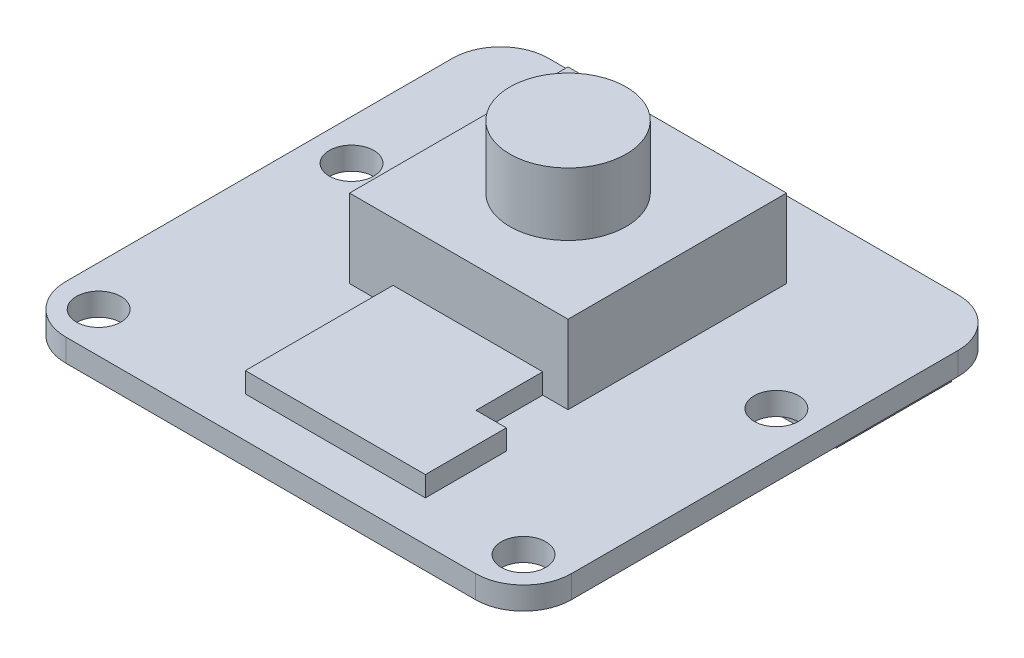
ISO-10303-21;
HEADER;
FILE_DESCRIPTION(('STEP AP214'),'2;1');
FILE_NAME('part.step','',(''),(''),'','','');
FILE_SCHEMA(('AUTOMOTIVE_DESIGN { 1 0 10303 214 1 1 1 1 }'));
ENDSEC;
DATA;
#1=APPLICATION_CONTEXT('core data for automotive mechanical design processes');
#2=APPLICATION_PROTOCOL_DEFINITION('international standard','automotive_design',2000,#1);
#3=PRODUCT_CONTEXT('',#1,'mechanical');
#4=PRODUCT('Part','Part','',(#3));
#5=PRODUCT_RELATED_PRODUCT_CATEGORY('part','',(#4));
#6=PRODUCT_DEFINITION_FORMATION('','',#4);
#7=PRODUCT_DEFINITION_CONTEXT('part definition',#1,'design');
#8=PRODUCT_DEFINITION('design','',#6,#7);
#9=PRODUCT_DEFINITION_SHAPE('','',#8);
#10=(LENGTH_UNIT() NAMED_UNIT(*) SI_UNIT(.MILLI.,.METRE.));
#11=(NAMED_UNIT(*) PLANE_ANGLE_UNIT() SI_UNIT($,.RADIAN.));
#12=(NAMED_UNIT(*) SI_UNIT($,.STERADIAN.) SOLID_ANGLE_UNIT());
#13=UNCERTAINTY_MEASURE_WITH_UNIT(LENGTH_MEASURE(1.E-05),#10,'distance_accuracy_value','');
#14=(GEOMETRIC_REPRESENTATION_CONTEXT(3) GLOBAL_UNCERTAINTY_ASSIGNED_CONTEXT((#13)) GLOBAL_UNIT_ASSIGNED_CONTEXT((#10,
#11,#12)) REPRESENTATION_CONTEXT('',''));
#15=CARTESIAN_POINT('',(0.,0.,0.));
#16=DIRECTION('',(0.,0.,1.));
#17=DIRECTION('',(1.,0.,0.));
#18=AXIS2_PLACEMENT_3D('',#15,#16,#17);
#19=CARTESIAN_POINT('',(-10.125,1.12,9.556));
#20=DIRECTION('',(0.,1.,0.));
#21=DIRECTION('',(0.,0.,1.));
#22=AXIS2_PLACEMENT_3D('',#19,#20,#21);
#23=PLANE('',#22);
#24=CARTESIAN_POINT('',(-10.5,1.12,-2.569));
#25=DIRECTION('',(0.,1.,0.));
#26=DIRECTION('',(0.,0.,1.));
#27=AXIS2_PLACEMENT_3D('',#24,#25,#26);
#28=CIRCLE('',#27,1.1);
#29=CARTESIAN_POINT('',(-10.5,1.12,-1.469));
#30=VERTEX_POINT('',#29);
#31=EDGE_CURVE('E287',#30,#30,#28,.T.);
#32=ORIENTED_EDGE('',*,*,#31,.F.);
#33=EDGE_LOOP('',(#32));
#34=FACE_BOUND('',#33,.T.);
#35=CARTESIAN_POINT('',(10.5,1.12,9.931));
#36=DIRECTION('',(0.,1.,0.));
#37=DIRECTION('',(0.,0.,1.));
#38=AXIS2_PLACEMENT_3D('',#35,#36,#37);
#39=CIRCLE('',#38,1.1);
#40=CARTESIAN_POINT('',(10.5,1.12,11.031));
#41=VERTEX_POINT('',#40);
#42=EDGE_CURVE('E286',#41,#41,#39,.T.);
#43=ORIENTED_EDGE('',*,*,#42,.F.);
#44=EDGE_LOOP('',(#43));
#45=FACE_BOUND('',#44,.T.);
#46=CARTESIAN_POINT('',(10.5,1.12,-2.569));
#47=DIRECTION('',(0.,1.,0.));
#48=DIRECTION('',(0.,0.,1.));
#49=AXIS2_PLACEMENT_3D('',#46,#47,#48);
#50=CIRCLE('',#49,1.1);
#51=CARTESIAN_POINT('',(10.5,1.12,-1.469));
#52=VERTEX_POINT('',#51);
#53=EDGE_CURVE('E280',#52,#52,#50,.T.);
#54=ORIENTED_EDGE('',*,*,#53,.F.);
#55=EDGE_LOOP('',(#54));
#56=FACE_BOUND('',#55,.T.);
#57=CARTESIAN_POINT('',(-10.5,1.12,9.931));
#58=DIRECTION('',(0.,1.,0.));
#59=DIRECTION('',(0.,0.,1.));
#60=AXIS2_PLACEMENT_3D('',#57,#58,#59);
#61=CIRCLE('',#60,1.1);
#62=CARTESIAN_POINT('',(-10.5,1.12,11.031));
#63=VERTEX_POINT('',#62);
#64=EDGE_CURVE('E294',#63,#63,#61,.T.);
#65=ORIENTED_EDGE('',*,*,#64,.F.);
#66=EDGE_LOOP('',(#65));
#67=FACE_BOUND('',#66,.T.);
#68=CARTESIAN_POINT('',(-10.125,1.12,9.556));
#69=DIRECTION('',(0.,1.,0.));
#70=DIRECTION('',(0.,0.,1.));
#71=AXIS2_PLACEMENT_3D('',#68,#69,#70);
#72=CIRCLE('',#71,2.375);
#73=CARTESIAN_POINT('',(-12.5,1.12,9.55599999999998));
#74=VERTEX_POINT('',#73);
#75=CARTESIAN_POINT('',(-10.125,1.12,11.931));
#76=VERTEX_POINT('',#75);
#77=EDGE_CURVE('E305',#74,#76,#72,.T.);
#78=ORIENTED_EDGE('',*,*,#77,.T.);
#79=DIRECTION('',(1.,0.,0.));
#80=VECTOR('',#79,1.);
#81=CARTESIAN_POINT('',(-10.125,1.12,11.931));
#82=LINE('',#81,#80);
#83=CARTESIAN_POINT('',(10.125,1.12,11.931));
#84=VERTEX_POINT('',#83);
#85=EDGE_CURVE('E308',#76,#84,#82,.T.);
#86=ORIENTED_EDGE('',*,*,#85,.T.);
#87=CARTESIAN_POINT('',(10.125,1.12,9.556));
#88=DIRECTION('',(0.,1.,0.));
#89=DIRECTION('',(0.,0.,1.));
#90=AXIS2_PLACEMENT_3D('',#87,#88,#89);
#91=CIRCLE('',#90,2.375);
#92=CARTESIAN_POINT('',(12.5,1.12,9.55599999999998));
#93=VERTEX_POINT('',#92);
#94=EDGE_CURVE('E311',#84,#93,#91,.T.);
#95=ORIENTED_EDGE('',*,*,#94,.T.);
#96=DIRECTION('',(0.,0.,-1.));
#97=VECTOR('',#96,1.);
#98=CARTESIAN_POINT('',(12.5,1.12,-9.55599999999998));
#99=LINE('',#98,#97);
#100=CARTESIAN_POINT('',(12.5,1.12,-9.55599999999998));
#101=VERTEX_POINT('',#100);
#102=EDGE_CURVE('E313',#93,#101,#99,.T.);
#103=ORIENTED_EDGE('',*,*,#102,.T.);
#104=CARTESIAN_POINT('',(10.125,1.12,-9.556));
#105=DIRECTION('',(0.,1.,0.));
#106=DIRECTION('',(0.,0.,-1.));
#107=AXIS2_PLACEMENT_3D('',#104,#105,#106);
#108=CIRCLE('',#107,2.375);
#109=CARTESIAN_POINT('',(10.125,1.12,-11.931));
#110=VERTEX_POINT('',#109);
#111=EDGE_CURVE('E315',#101,#110,#108,.T.);
#112=ORIENTED_EDGE('',*,*,#111,.T.);
#113=DIRECTION('',(-1.,0.,0.));
#114=VECTOR('',#113,1.);
#115=CARTESIAN_POINT('',(-10.125,1.12,-11.931));
#116=LINE('',#115,#114);
#117=CARTESIAN_POINT('',(-10.125,1.12,-11.931));
#118=VERTEX_POINT('',#117);
#119=EDGE_CURVE('E317',#110,#118,#116,.T.);
#120=ORIENTED_EDGE('',*,*,#119,.T.);
#121=CARTESIAN_POINT('',(-10.125,1.12,-9.556));
#122=DIRECTION('',(0.,1.,0.));
#123=DIRECTION('',(0.,0.,1.));
#124=AXIS2_PLACEMENT_3D('',#121,#122,#123);
#125=CIRCLE('',#124,2.375);
#126=CARTESIAN_POINT('',(-12.5,1.12,-9.55599999999998));
#127=VERTEX_POINT('',#126);
#128=EDGE_CURVE('E319',#118,#127,#125,.T.);
#129=ORIENTED_EDGE('',*,*,#128,.T.);
#130=DIRECTION('',(0.,0.,1.));
#131=VECTOR('',#130,1.);
#132=CARTESIAN_POINT('',(-12.5,1.12,-9.55599999999998));
#133=LINE('',#132,#131);
#134=EDGE_CURVE('E321',#127,#74,#133,.T.);
#135=ORIENTED_EDGE('',*,*,#134,.T.);
#136=EDGE_LOOP('',(#78,#86,#95,#103,#112,#120,#129,#135));
#137=FACE_BOUND('',#136,.T.);
#138=DIRECTION('',(1.,0.,0.));
#139=VECTOR('',#138,1.);
#140=CARTESIAN_POINT('',(-5.4,1.12,2.631));
#141=LINE('',#140,#139);
#142=CARTESIAN_POINT('',(4.15,1.12,2.631));
#143=VERTEX_POINT('',#142);
#144=CARTESIAN_POINT('',(5.4,1.12,2.631));
#145=VERTEX_POINT('',#144);
#146=EDGE_CURVE('E268',#143,#145,#141,.T.);
#147=ORIENTED_EDGE('',*,*,#146,.F.);
#148=DIRECTION('',(0.,0.,-1.));
#149=VECTOR('',#148,1.);
#150=CARTESIAN_POINT('',(4.15,1.12,5.931));
#151=LINE('',#150,#149);
#152=CARTESIAN_POINT('',(4.15,1.12,5.931));
#153=VERTEX_POINT('',#152);
#154=EDGE_CURVE('E530',#153,#143,#151,.T.);
#155=ORIENTED_EDGE('',*,*,#154,.F.);
#156=DIRECTION('',(-1.,0.,0.));
#157=VECTOR('',#156,1.);
#158=CARTESIAN_POINT('',(4.15,1.12,5.931));
#159=LINE('',#158,#157);
#160=CARTESIAN_POINT('',(5.65,1.12,5.931));
#161=VERTEX_POINT('',#160);
#162=EDGE_CURVE('E537',#161,#153,#159,.T.);
#163=ORIENTED_EDGE('',*,*,#162,.F.);
#164=DIRECTION('',(0.,0.,-1.));
#165=VECTOR('',#164,1.);
#166=CARTESIAN_POINT('',(5.65,1.12,9.931));
#167=LINE('',#166,#165);
#168=CARTESIAN_POINT('',(5.65,1.12,9.931));
#169=VERTEX_POINT('',#168);
#170=EDGE_CURVE('E535',#169,#161,#167,.T.);
#171=ORIENTED_EDGE('',*,*,#170,.F.);
#172=DIRECTION('',(1.,0.,0.));
#173=VECTOR('',#172,1.);
#174=CARTESIAN_POINT('',(-3.25,1.12,9.931));
#175=LINE('',#174,#173);
#176=CARTESIAN_POINT('',(-3.25,1.12,9.931));
#177=VERTEX_POINT('',#176);
#178=EDGE_CURVE('E212',#177,#169,#175,.T.);
#179=ORIENTED_EDGE('',*,*,#178,.F.);
#180=DIRECTION('',(0.,0.,1.));
#181=VECTOR('',#180,1.);
#182=CARTESIAN_POINT('',(-3.25,1.12,9.931));
#183=LINE('',#182,#181);
#184=CARTESIAN_POINT('',(-3.25,1.12,2.631));
#185=VERTEX_POINT('',#184);
#186=EDGE_CURVE('E208',#185,#177,#183,.T.);
#187=ORIENTED_EDGE('',*,*,#186,.F.);
#188=CARTESIAN_POINT('',(-5.4,1.12,2.631));
#189=VERTEX_POINT('',#188);
#190=EDGE_CURVE('E253',#189,#185,#141,.T.);
#191=ORIENTED_EDGE('',*,*,#190,.F.);
#192=DIRECTION('',(0.,0.,1.));
#193=VECTOR('',#192,1.);
#194=CARTESIAN_POINT('',(-5.4,1.12,-8.169));
#195=LINE('',#194,#193);
#196=CARTESIAN_POINT('',(-5.4,1.12,-8.169));
#197=VERTEX_POINT('',#196);
#198=EDGE_CURVE('E265',#197,#189,#195,.T.);
#199=ORIENTED_EDGE('',*,*,#198,.F.);
#200=DIRECTION('',(-1.,0.,0.));
#201=VECTOR('',#200,1.);
#202=CARTESIAN_POINT('',(-5.4,1.12,-8.169));
#203=LINE('',#202,#201);
#204=CARTESIAN_POINT('',(5.4,1.12,-8.169));
#205=VERTEX_POINT('',#204);
#206=EDGE_CURVE('E263',#205,#197,#203,.T.);
#207=ORIENTED_EDGE('',*,*,#206,.F.);
#208=DIRECTION('',(0.,0.,-1.));
#209=VECTOR('',#208,1.);
#210=CARTESIAN_POINT('',(5.4,1.12,-8.169));
#211=LINE('',#210,#209);
#212=EDGE_CURVE('E260',#145,#205,#211,.T.);
#213=ORIENTED_EDGE('',*,*,#212,.F.);
#214=EDGE_LOOP('',(#147,#155,#163,#171,#179,#187,#191,#199,#207,#213));
#215=FACE_BOUND('',#214,.T.);
#216=ADVANCED_FACE('F38',(#34,#45,#56,#67,#137,#215),#23,.T.);
#217=CARTESIAN_POINT('',(-5.4,4.995,2.631));
#218=DIRECTION('',(0.,0.,-1.));
#219=DIRECTION('',(-1.,0.,0.));
#220=AXIS2_PLACEMENT_3D('',#217,#218,#219);
#221=PLANE('',#220);
#222=DIRECTION('',(0.,-1.,0.));
#223=VECTOR('',#222,1.);
#224=CARTESIAN_POINT('',(4.15,2.12,2.631));
#225=LINE('',#224,#223);
#226=CARTESIAN_POINT('',(4.15,2.12,2.631));
#227=VERTEX_POINT('',#226);
#228=EDGE_CURVE('E54',#227,#143,#225,.T.);
#229=ORIENTED_EDGE('',*,*,#228,.T.);
#230=ORIENTED_EDGE('',*,*,#146,.T.);
#231=DIRECTION('',(0.,-1.,0.));
#232=VECTOR('',#231,1.);
#233=CARTESIAN_POINT('',(5.4,4.995,2.631));
#234=LINE('',#233,#232);
#235=CARTESIAN_POINT('',(5.4,4.995,2.631));
#236=VERTEX_POINT('',#235);
#237=EDGE_CURVE('E259',#236,#145,#234,.T.);
#238=ORIENTED_EDGE('',*,*,#237,.F.);
#239=DIRECTION('',(1.,0.,0.));
#240=VECTOR('',#239,1.);
#241=CARTESIAN_POINT('',(-5.4,4.995,2.631));
#242=LINE('',#241,#240);
#243=CARTESIAN_POINT('',(-5.4,4.995,2.631));
#244=VERTEX_POINT('',#243);
#245=EDGE_CURVE('E257',#244,#236,#242,.T.);
#246=ORIENTED_EDGE('',*,*,#245,.F.);
#247=DIRECTION('',(0.,-1.,0.));
#248=VECTOR('',#247,1.);
#249=CARTESIAN_POINT('',(-5.4,4.995,2.631));
#250=LINE('',#249,#248);
#251=EDGE_CURVE('E273',#244,#189,#250,.T.);
#252=ORIENTED_EDGE('',*,*,#251,.T.);
#253=ORIENTED_EDGE('',*,*,#190,.T.);
#254=DIRECTION('',(0.,-1.,0.));
#255=VECTOR('',#254,1.);
#256=CARTESIAN_POINT('',(-3.25,2.12,2.631));
#257=LINE('',#256,#255);
#258=CARTESIAN_POINT('',(-3.25,2.12,2.631));
#259=VERTEX_POINT('',#258);
#260=EDGE_CURVE('E528',#259,#185,#257,.T.);
#261=ORIENTED_EDGE('',*,*,#260,.F.);
#262=DIRECTION('',(-1.,0.,0.));
#263=VECTOR('',#262,1.);
#264=CARTESIAN_POINT('',(-3.25,2.12,2.631));
#265=LINE('',#264,#263);
#266=EDGE_CURVE('E748',#227,#259,#265,.T.);
#267=ORIENTED_EDGE('',*,*,#266,.F.);
#268=EDGE_LOOP('',(#229,#230,#238,#246,#252,#253,#261,#267));
#269=FACE_BOUND('',#268,.T.);
#270=ADVANCED_FACE('F423',(#269),#221,.F.);
#271=CARTESIAN_POINT('',(-10.125,0.,9.556));
#272=DIRECTION('',(0.,1.,0.));
#273=DIRECTION('',(0.,0.,1.));
#274=AXIS2_PLACEMENT_3D('',#271,#272,#273);
#275=PLANE('',#274);
#276=CARTESIAN_POINT('',(-10.5,0.,9.931));
#277=DIRECTION('',(0.,1.,0.));
#278=DIRECTION('',(0.,0.,1.));
#279=AXIS2_PLACEMENT_3D('',#276,#277,#278);
#280=CIRCLE('',#279,1.1);
#281=CARTESIAN_POINT('',(-10.5,0.,11.031));
#282=VERTEX_POINT('',#281);
#283=EDGE_CURVE('E301',#282,#282,#280,.F.);
#284=ORIENTED_EDGE('',*,*,#283,.F.);
#285=EDGE_LOOP('',(#284));
#286=FACE_BOUND('',#285,.T.);
#287=CARTESIAN_POINT('',(10.5,0.,-2.569));
#288=DIRECTION('',(0.,1.,0.));
#289=DIRECTION('',(0.,0.,1.));
#290=AXIS2_PLACEMENT_3D('',#287,#288,#289);
#291=CIRCLE('',#290,1.1);
#292=CARTESIAN_POINT('',(10.5,0.,-1.469));
#293=VERTEX_POINT('',#292);
#294=EDGE_CURVE('E283',#293,#293,#291,.F.);
#295=ORIENTED_EDGE('',*,*,#294,.F.);
#296=EDGE_LOOP('',(#295));
#297=FACE_BOUND('',#296,.T.);
#298=CARTESIAN_POINT('',(10.5,0.,9.931));
#299=DIRECTION('',(0.,1.,0.));
#300=DIRECTION('',(0.,0.,1.));
#301=AXIS2_PLACEMENT_3D('',#298,#299,#300);
#302=CIRCLE('',#301,1.1);
#303=CARTESIAN_POINT('',(10.5,0.,11.031));
#304=VERTEX_POINT('',#303);
#305=EDGE_CURVE('E291',#304,#304,#302,.F.);
#306=ORIENTED_EDGE('',*,*,#305,.F.);
#307=EDGE_LOOP('',(#306));
#308=FACE_BOUND('',#307,.T.);
#309=CARTESIAN_POINT('',(-10.5,0.,-2.569));
#310=DIRECTION('',(0.,1.,0.));
#311=DIRECTION('',(0.,0.,1.));
#312=AXIS2_PLACEMENT_3D('',#309,#310,#311);
#313=CIRCLE('',#312,1.1);
#314=CARTESIAN_POINT('',(-10.5,0.,-1.469));
#315=VERTEX_POINT('',#314);
#316=EDGE_CURVE('E290',#315,#315,#313,.F.);
#317=ORIENTED_EDGE('',*,*,#316,.F.);
#318=EDGE_LOOP('',(#317));
#319=FACE_BOUND('',#318,.T.);
#320=DIRECTION('',(0.,0.,1.));
#321=VECTOR('',#320,1.);
#322=CARTESIAN_POINT('',(9.80500000000001,0.,-11.931));
#323=LINE('',#322,#321);
#324=CARTESIAN_POINT('',(9.805,0.,-11.931));
#325=VERTEX_POINT('',#324);
#326=CARTESIAN_POINT('',(9.80500000000001,0.,-6.221));
#327=VERTEX_POINT('',#326);
#328=EDGE_CURVE('E214',#325,#327,#323,.T.);
#329=ORIENTED_EDGE('',*,*,#328,.F.);
#330=DIRECTION('',(-1.,0.,0.));
#331=VECTOR('',#330,1.);
#332=CARTESIAN_POINT('',(-10.125,0.,-11.931));
#333=LINE('',#332,#331);
#334=CARTESIAN_POINT('',(10.125,0.,-11.931));
#335=VERTEX_POINT('',#334);
#336=EDGE_CURVE('E335',#335,#325,#333,.T.);
#337=ORIENTED_EDGE('',*,*,#336,.F.);
#338=CARTESIAN_POINT('',(10.125,0.,-9.556));
#339=DIRECTION('',(0.,1.,0.));
#340=DIRECTION('',(0.,0.,-1.));
#341=AXIS2_PLACEMENT_3D('',#338,#339,#340);
#342=CIRCLE('',#341,2.375);
#343=CARTESIAN_POINT('',(12.5,0.,-9.55599999999998));
#344=VERTEX_POINT('',#343);
#345=EDGE_CURVE('E332',#344,#335,#342,.T.);
#346=ORIENTED_EDGE('',*,*,#345,.F.);
#347=DIRECTION('',(0.,0.,-1.));
#348=VECTOR('',#347,1.);
#349=CARTESIAN_POINT('',(12.5,0.,-9.55599999999998));
#350=LINE('',#349,#348);
#351=CARTESIAN_POINT('',(12.5,0.,9.55599999999998));
#352=VERTEX_POINT('',#351);
#353=EDGE_CURVE('E330',#352,#344,#350,.T.);
#354=ORIENTED_EDGE('',*,*,#353,.F.);
#355=CARTESIAN_POINT('',(10.125,0.,9.556));
#356=DIRECTION('',(0.,1.,0.));
#357=DIRECTION('',(0.,0.,1.));
#358=AXIS2_PLACEMENT_3D('',#355,#356,#357);
#359=CIRCLE('',#358,2.375);
#360=CARTESIAN_POINT('',(10.125,0.,11.931));
#361=VERTEX_POINT('',#360);
#362=EDGE_CURVE('E328',#361,#352,#359,.T.);
#363=ORIENTED_EDGE('',*,*,#362,.F.);
#364=DIRECTION('',(1.,0.,0.));
#365=VECTOR('',#364,1.);
#366=CARTESIAN_POINT('',(-10.125,0.,11.931));
#367=LINE('',#366,#365);
#368=CARTESIAN_POINT('',(-10.125,0.,11.931));
#369=VERTEX_POINT('',#368);
#370=EDGE_CURVE('E326',#369,#361,#367,.T.);
#371=ORIENTED_EDGE('',*,*,#370,.F.);
#372=CARTESIAN_POINT('',(-10.125,0.,9.556));
#373=DIRECTION('',(0.,1.,0.));
#374=DIRECTION('',(0.,0.,1.));
#375=AXIS2_PLACEMENT_3D('',#372,#373,#374);
#376=CIRCLE('',#375,2.375);
#377=CARTESIAN_POINT('',(-12.5,0.,9.55599999999998));
#378=VERTEX_POINT('',#377);
#379=EDGE_CURVE('E304',#378,#369,#376,.T.);
#380=ORIENTED_EDGE('',*,*,#379,.F.);
#381=DIRECTION('',(0.,0.,1.));
#382=VECTOR('',#381,1.);
#383=CARTESIAN_POINT('',(-12.5,0.,-9.55599999999998));
#384=LINE('',#383,#382);
#385=CARTESIAN_POINT('',(-12.5,0.,-9.55599999999998));
#386=VERTEX_POINT('',#385);
#387=EDGE_CURVE('E309',#386,#378,#384,.T.);
#388=ORIENTED_EDGE('',*,*,#387,.F.);
#389=CARTESIAN_POINT('',(-10.125,0.,-9.556));
#390=DIRECTION('',(0.,1.,0.));
#391=DIRECTION('',(0.,0.,1.));
#392=AXIS2_PLACEMENT_3D('',#389,#390,#391);
#393=CIRCLE('',#392,2.375);
#394=CARTESIAN_POINT('',(-10.125,0.,-11.931));
#395=VERTEX_POINT('',#394);
#396=EDGE_CURVE('E338',#395,#386,#393,.T.);
#397=ORIENTED_EDGE('',*,*,#396,.F.);
#398=CARTESIAN_POINT('',(-9.80499999999999,0.,-11.931));
#399=VERTEX_POINT('',#398);
#400=EDGE_CURVE('E334',#399,#395,#333,.T.);
#401=ORIENTED_EDGE('',*,*,#400,.F.);
#402=DIRECTION('',(0.,0.,-1.));
#403=VECTOR('',#402,1.);
#404=CARTESIAN_POINT('',(-9.80499999999999,0.,-11.931));
#405=LINE('',#404,#403);
#406=CARTESIAN_POINT('',(-9.80499999999999,0.,-6.221));
#407=VERTEX_POINT('',#406);
#408=EDGE_CURVE('E226',#407,#399,#405,.T.);
#409=ORIENTED_EDGE('',*,*,#408,.F.);
#410=DIRECTION('',(-1.,0.,0.));
#411=VECTOR('',#410,1.);
#412=CARTESIAN_POINT('',(-9.80499999999999,0.,-6.221));
#413=LINE('',#412,#411);
#414=EDGE_CURVE('E62',#327,#407,#413,.T.);
#415=ORIENTED_EDGE('',*,*,#414,.F.);
#416=EDGE_LOOP('',(#329,#337,#346,#354,#363,#371,#380,#388,#397,#401,#409,#415));
#417=FACE_BOUND('',#416,.T.);
#418=ADVANCED_FACE('F367',(#286,#297,#308,#319,#417),#275,.F.);
#419=CARTESIAN_POINT('',(-10.125,1.12,9.556));
#420=DIRECTION('',(0.,-1.,0.));
#421=DIRECTION('',(0.,0.,-1.));
#422=AXIS2_PLACEMENT_3D('',#419,#420,#421);
#423=CYLINDRICAL_SURFACE('',#422,2.375);
#424=ORIENTED_EDGE('',*,*,#379,.T.);
#425=DIRECTION('',(0.,-1.,0.));
#426=VECTOR('',#425,1.);
#427=CARTESIAN_POINT('',(-10.125,1.12,11.931));
#428=LINE('',#427,#426);
#429=EDGE_CURVE('E11',#76,#369,#428,.T.);
#430=ORIENTED_EDGE('',*,*,#429,.F.);
#431=ORIENTED_EDGE('',*,*,#77,.F.);
#432=DIRECTION('',(0.,-1.,0.));
#433=VECTOR('',#432,1.);
#434=CARTESIAN_POINT('',(-12.5,1.12,9.55599999999998));
#435=LINE('',#434,#433);
#436=EDGE_CURVE('E323',#74,#378,#435,.T.);
#437=ORIENTED_EDGE('',*,*,#436,.T.);
#438=EDGE_LOOP('',(#424,#430,#431,#437));
#439=FACE_BOUND('',#438,.T.);
#440=ADVANCED_FACE('F40',(#439),#423,.T.);
#441=CARTESIAN_POINT('',(-10.125,1.12,11.931));
#442=DIRECTION('',(0.,0.,-1.));
#443=DIRECTION('',(-1.,0.,0.));
#444=AXIS2_PLACEMENT_3D('',#441,#442,#443);
#445=PLANE('',#444);
#446=ORIENTED_EDGE('',*,*,#370,.T.);
#447=DIRECTION('',(0.,-1.,0.));
#448=VECTOR('',#447,1.);
#449=CARTESIAN_POINT('',(10.125,1.12,11.931));
#450=LINE('',#449,#448);
#451=EDGE_CURVE('E47',#84,#361,#450,.T.);
#452=ORIENTED_EDGE('',*,*,#451,.F.);
#453=ORIENTED_EDGE('',*,*,#85,.F.);
#454=ORIENTED_EDGE('',*,*,#429,.T.);
#455=EDGE_LOOP('',(#446,#452,#453,#454));
#456=FACE_BOUND('',#455,.T.);
#457=ADVANCED_FACE('F385',(#456),#445,.F.);
#458=CARTESIAN_POINT('',(10.125,1.12,9.556));
#459=DIRECTION('',(0.,-1.,0.));
#460=DIRECTION('',(0.,0.,-1.));
#461=AXIS2_PLACEMENT_3D('',#458,#459,#460);
#462=CYLINDRICAL_SURFACE('',#461,2.375);
#463=ORIENTED_EDGE('',*,*,#362,.T.);
#464=DIRECTION('',(0.,-1.,0.));
#465=VECTOR('',#464,1.);
#466=CARTESIAN_POINT('',(12.5,1.12,9.55599999999998));
#467=LINE('',#466,#465);
#468=EDGE_CURVE('E355',#93,#352,#467,.T.);
#469=ORIENTED_EDGE('',*,*,#468,.F.);
#470=ORIENTED_EDGE('',*,*,#94,.F.);
#471=ORIENTED_EDGE('',*,*,#451,.T.);
#472=EDGE_LOOP('',(#463,#469,#470,#471));
#473=FACE_BOUND('',#472,.T.);
#474=ADVANCED_FACE('F363',(#473),#462,.T.);
#475=CARTESIAN_POINT('',(12.5,1.12,-9.55599999999998));
#476=DIRECTION('',(-1.,0.,0.));
#477=DIRECTION('',(0.,0.,1.));
#478=AXIS2_PLACEMENT_3D('',#475,#476,#477);
#479=PLANE('',#478);
#480=ORIENTED_EDGE('',*,*,#353,.T.);
#481=DIRECTION('',(0.,-1.,0.));
#482=VECTOR('',#481,1.);
#483=CARTESIAN_POINT('',(12.5,1.12,-9.55599999999998));
#484=LINE('',#483,#482);
#485=EDGE_CURVE('E352',#101,#344,#484,.T.);
#486=ORIENTED_EDGE('',*,*,#485,.F.);
#487=ORIENTED_EDGE('',*,*,#102,.F.);
#488=ORIENTED_EDGE('',*,*,#468,.T.);
#489=EDGE_LOOP('',(#480,#486,#487,#488));
#490=FACE_BOUND('',#489,.T.);
#491=ADVANCED_FACE('F373',(#490),#479,.F.);
#492=CARTESIAN_POINT('',(10.125,1.12,-9.556));
#493=DIRECTION('',(0.,-1.,0.));
#494=DIRECTION('',(0.,0.,-1.));
#495=AXIS2_PLACEMENT_3D('',#492,#493,#494);
#496=CYLINDRICAL_SURFACE('',#495,2.375);
#497=ORIENTED_EDGE('',*,*,#345,.T.);
#498=DIRECTION('',(0.,-1.,0.));
#499=VECTOR('',#498,1.);
#500=CARTESIAN_POINT('',(10.125,1.12,-11.931));
#501=LINE('',#500,#499);
#502=EDGE_CURVE('E349',#110,#335,#501,.T.);
#503=ORIENTED_EDGE('',*,*,#502,.F.);
#504=ORIENTED_EDGE('',*,*,#111,.F.);
#505=ORIENTED_EDGE('',*,*,#485,.T.);
#506=EDGE_LOOP('',(#497,#503,#504,#505));
#507=FACE_BOUND('',#506,.T.);
#508=ADVANCED_FACE('F377',(#507),#496,.T.);
#509=CARTESIAN_POINT('',(-10.125,1.12,-11.931));
#510=DIRECTION('',(0.,0.,1.));
#511=DIRECTION('',(1.,0.,0.));
#512=AXIS2_PLACEMENT_3D('',#509,#510,#511);
#513=PLANE('',#512);
#514=ORIENTED_EDGE('',*,*,#336,.T.);
#515=DIRECTION('',(0.,1.,0.));
#516=VECTOR('',#515,1.);
#517=CARTESIAN_POINT('',(9.80500000000001,-2.75,-11.931));
#518=LINE('',#517,#516);
#519=CARTESIAN_POINT('',(9.80500000000001,-2.75,-11.931));
#520=VERTEX_POINT('',#519);
#521=EDGE_CURVE('E231',#520,#325,#518,.T.);
#522=ORIENTED_EDGE('',*,*,#521,.F.);
#523=DIRECTION('',(1.,0.,0.));
#524=VECTOR('',#523,1.);
#525=CARTESIAN_POINT('',(-9.80499999999999,-2.75,-11.931));
#526=LINE('',#525,#524);
#527=CARTESIAN_POINT('',(-9.80499999999999,-2.75,-11.931));
#528=VERTEX_POINT('',#527);
#529=EDGE_CURVE('E230',#528,#520,#526,.T.);
#530=ORIENTED_EDGE('',*,*,#529,.F.);
#531=DIRECTION('',(0.,1.,0.));
#532=VECTOR('',#531,1.);
#533=CARTESIAN_POINT('',(-9.80499999999999,-2.75,-11.931));
#534=LINE('',#533,#532);
#535=EDGE_CURVE('E238',#528,#399,#534,.T.);
#536=ORIENTED_EDGE('',*,*,#535,.T.);
#537=ORIENTED_EDGE('',*,*,#400,.T.);
#538=DIRECTION('',(0.,-1.,0.));
#539=VECTOR('',#538,1.);
#540=CARTESIAN_POINT('',(-10.125,1.12,-11.931));
#541=LINE('',#540,#539);
#542=EDGE_CURVE('E346',#118,#395,#541,.T.);
#543=ORIENTED_EDGE('',*,*,#542,.F.);
#544=ORIENTED_EDGE('',*,*,#119,.F.);
#545=ORIENTED_EDGE('',*,*,#502,.T.);
#546=EDGE_LOOP('',(#514,#522,#530,#536,#537,#543,#544,#545));
#547=FACE_BOUND('',#546,.T.);
#548=ADVANCED_FACE('F398',(#547),#513,.F.);
#549=CARTESIAN_POINT('',(-10.125,1.12,-9.556));
#550=DIRECTION('',(0.,-1.,0.));
#551=DIRECTION('',(0.,0.,-1.));
#552=AXIS2_PLACEMENT_3D('',#549,#550,#551);
#553=CYLINDRICAL_SURFACE('',#552,2.375);
#554=ORIENTED_EDGE('',*,*,#396,.T.);
#555=DIRECTION('',(0.,-1.,0.));
#556=VECTOR('',#555,1.);
#557=CARTESIAN_POINT('',(-12.5,1.12,-9.55599999999998));
#558=LINE('',#557,#556);
#559=EDGE_CURVE('E343',#127,#386,#558,.T.);
#560=ORIENTED_EDGE('',*,*,#559,.F.);
#561=ORIENTED_EDGE('',*,*,#128,.F.);
#562=ORIENTED_EDGE('',*,*,#542,.T.);
#563=EDGE_LOOP('',(#554,#560,#561,#562));
#564=FACE_BOUND('',#563,.T.);
#565=ADVANCED_FACE('F396',(#564),#553,.T.);
#566=CARTESIAN_POINT('',(-12.5,1.12,-9.55599999999998));
#567=DIRECTION('',(1.,0.,0.));
#568=DIRECTION('',(0.,0.,-1.));
#569=AXIS2_PLACEMENT_3D('',#566,#567,#568);
#570=PLANE('',#569);
#571=ORIENTED_EDGE('',*,*,#387,.T.);
#572=ORIENTED_EDGE('',*,*,#436,.F.);
#573=ORIENTED_EDGE('',*,*,#134,.F.);
#574=ORIENTED_EDGE('',*,*,#559,.T.);
#575=EDGE_LOOP('',(#571,#572,#573,#574));
#576=FACE_BOUND('',#575,.T.);
#577=ADVANCED_FACE('F391',(#576),#570,.F.);
#578=CARTESIAN_POINT('',(-10.5,-3.11126983722081,9.931));
#579=DIRECTION('',(0.,1.,0.));
#580=DIRECTION('',(0.,0.,1.));
#581=AXIS2_PLACEMENT_3D('',#578,#579,#580);
#582=CYLINDRICAL_SURFACE('',#581,1.1);
#583=ORIENTED_EDGE('',*,*,#283,.T.);
#584=EDGE_LOOP('',(#583));
#585=FACE_BOUND('',#584,.T.);
#586=ORIENTED_EDGE('',*,*,#64,.T.);
#587=EDGE_LOOP('',(#586));
#588=FACE_BOUND('',#587,.T.);
#589=ADVANCED_FACE('F435',(#585,#588),#582,.F.);
#590=CARTESIAN_POINT('',(10.5,-3.11126983722081,-2.569));
#591=DIRECTION('',(0.,1.,0.));
#592=DIRECTION('',(0.,0.,1.));
#593=AXIS2_PLACEMENT_3D('',#590,#591,#592);
#594=CYLINDRICAL_SURFACE('',#593,1.1);
#595=ORIENTED_EDGE('',*,*,#294,.T.);
#596=EDGE_LOOP('',(#595));
#597=FACE_BOUND('',#596,.T.);
#598=ORIENTED_EDGE('',*,*,#53,.T.);
#599=EDGE_LOOP('',(#598));
#600=FACE_BOUND('',#599,.T.);
#601=ADVANCED_FACE('F578',(#597,#600),#594,.F.);
#602=CARTESIAN_POINT('',(10.5,-3.11126983722081,9.931));
#603=DIRECTION('',(0.,1.,0.));
#604=DIRECTION('',(0.,0.,1.));
#605=AXIS2_PLACEMENT_3D('',#602,#603,#604);
#606=CYLINDRICAL_SURFACE('',#605,1.1);
#607=ORIENTED_EDGE('',*,*,#305,.T.);
#608=EDGE_LOOP('',(#607));
#609=FACE_BOUND('',#608,.T.);
#610=ORIENTED_EDGE('',*,*,#42,.T.);
#611=EDGE_LOOP('',(#610));
#612=FACE_BOUND('',#611,.T.);
#613=ADVANCED_FACE('F581',(#609,#612),#606,.F.);
#614=CARTESIAN_POINT('',(-10.5,-3.11126983722081,-2.569));
#615=DIRECTION('',(0.,1.,0.));
#616=DIRECTION('',(0.,0.,1.));
#617=AXIS2_PLACEMENT_3D('',#614,#615,#616);
#618=CYLINDRICAL_SURFACE('',#617,1.1);
#619=ORIENTED_EDGE('',*,*,#316,.T.);
#620=EDGE_LOOP('',(#619));
#621=FACE_BOUND('',#620,.T.);
#622=ORIENTED_EDGE('',*,*,#31,.T.);
#623=EDGE_LOOP('',(#622));
#624=FACE_BOUND('',#623,.T.);
#625=ADVANCED_FACE('F575',(#621,#624),#618,.F.);
#626=CARTESIAN_POINT('',(5.4,4.995,-8.169));
#627=DIRECTION('',(-1.,0.,0.));
#628=DIRECTION('',(0.,0.,1.));
#629=AXIS2_PLACEMENT_3D('',#626,#627,#628);
#630=PLANE('',#629);
#631=ORIENTED_EDGE('',*,*,#212,.T.);
#632=DIRECTION('',(0.,-1.,0.));
#633=VECTOR('',#632,1.);
#634=CARTESIAN_POINT('',(5.4,4.995,-8.169));
#635=LINE('',#634,#633);
#636=CARTESIAN_POINT('',(5.4,4.995,-8.169));
#637=VERTEX_POINT('',#636);
#638=EDGE_CURVE('E278',#637,#205,#635,.T.);
#639=ORIENTED_EDGE('',*,*,#638,.F.);
#640=DIRECTION('',(0.,0.,-1.));
#641=VECTOR('',#640,1.);
#642=CARTESIAN_POINT('',(5.4,4.995,-8.169));
#643=LINE('',#642,#641);
#644=EDGE_CURVE('E249',#236,#637,#643,.T.);
#645=ORIENTED_EDGE('',*,*,#644,.F.);
#646=ORIENTED_EDGE('',*,*,#237,.T.);
#647=EDGE_LOOP('',(#631,#639,#645,#646));
#648=FACE_BOUND('',#647,.T.);
#649=ADVANCED_FACE('F556',(#648),#630,.F.);
#650=CARTESIAN_POINT('',(-5.4,4.995,-8.169));
#651=DIRECTION('',(0.,0.,1.));
#652=DIRECTION('',(1.,0.,0.));
#653=AXIS2_PLACEMENT_3D('',#650,#651,#652);
#654=PLANE('',#653);
#655=ORIENTED_EDGE('',*,*,#206,.T.);
#656=DIRECTION('',(0.,-1.,0.));
#657=VECTOR('',#656,1.);
#658=CARTESIAN_POINT('',(-5.4,4.995,-8.169));
#659=LINE('',#658,#657);
#660=CARTESIAN_POINT('',(-5.4,4.995,-8.169));
#661=VERTEX_POINT('',#660);
#662=EDGE_CURVE('E275',#661,#197,#659,.T.);
#663=ORIENTED_EDGE('',*,*,#662,.F.);
#664=DIRECTION('',(-1.,0.,0.));
#665=VECTOR('',#664,1.);
#666=CARTESIAN_POINT('',(-5.4,4.995,-8.169));
#667=LINE('',#666,#665);
#668=EDGE_CURVE('E252',#637,#661,#667,.T.);
#669=ORIENTED_EDGE('',*,*,#668,.F.);
#670=ORIENTED_EDGE('',*,*,#638,.T.);
#671=EDGE_LOOP('',(#655,#663,#669,#670));
#672=FACE_BOUND('',#671,.T.);
#673=ADVANCED_FACE('F567',(#672),#654,.F.);
#674=CARTESIAN_POINT('',(-5.4,4.995,-8.169));
#675=DIRECTION('',(1.,0.,0.));
#676=DIRECTION('',(0.,0.,-1.));
#677=AXIS2_PLACEMENT_3D('',#674,#675,#676);
#678=PLANE('',#677);
#679=ORIENTED_EDGE('',*,*,#198,.T.);
#680=ORIENTED_EDGE('',*,*,#251,.F.);
#681=DIRECTION('',(0.,0.,1.));
#682=VECTOR('',#681,1.);
#683=CARTESIAN_POINT('',(-5.4,4.995,-8.169));
#684=LINE('',#683,#682);
#685=EDGE_CURVE('E255',#661,#244,#684,.T.);
#686=ORIENTED_EDGE('',*,*,#685,.F.);
#687=ORIENTED_EDGE('',*,*,#662,.T.);
#688=EDGE_LOOP('',(#679,#680,#686,#687));
#689=FACE_BOUND('',#688,.T.);
#690=ADVANCED_FACE('F565',(#689),#678,.F.);
#691=CARTESIAN_POINT('',(0.,4.995,0.));
#692=DIRECTION('',(0.,1.,0.));
#693=DIRECTION('',(0.,0.,1.));
#694=AXIS2_PLACEMENT_3D('',#691,#692,#693);
#695=PLANE('',#694);
#696=CARTESIAN_POINT('',(0.,4.995,-2.769));
#697=DIRECTION('',(0.,1.,0.));
#698=DIRECTION('',(0.,0.,1.));
#699=AXIS2_PLACEMENT_3D('',#696,#697,#698);
#700=CIRCLE('',#699,2.875);
#701=CARTESIAN_POINT('',(0.,4.995,0.105999999999998));
#702=VERTEX_POINT('',#701);
#703=EDGE_CURVE('E42',#702,#702,#700,.F.);
#704=ORIENTED_EDGE('',*,*,#703,.T.);
#705=EDGE_LOOP('',(#704));
#706=FACE_BOUND('',#705,.T.);
#707=ORIENTED_EDGE('',*,*,#644,.T.);
#708=ORIENTED_EDGE('',*,*,#668,.T.);
#709=ORIENTED_EDGE('',*,*,#685,.T.);
#710=ORIENTED_EDGE('',*,*,#245,.T.);
#711=EDGE_LOOP('',(#707,#708,#709,#710));
#712=FACE_BOUND('',#711,.T.);
#713=ADVANCED_FACE('F559',(#706,#712),#695,.T.);
#714=CARTESIAN_POINT('',(0.,8.1,-2.769));
#715=DIRECTION('',(0.,-1.,0.));
#716=DIRECTION('',(0.,0.,-1.));
#717=AXIS2_PLACEMENT_3D('',#714,#715,#716);
#718=CYLINDRICAL_SURFACE('',#717,2.875);
#719=ORIENTED_EDGE('',*,*,#703,.F.);
#720=EDGE_LOOP('',(#719));
#721=FACE_BOUND('',#720,.T.);
#722=CARTESIAN_POINT('',(0.,8.1,-2.769));
#723=DIRECTION('',(0.,1.,0.));
#724=DIRECTION('',(0.,0.,1.));
#725=AXIS2_PLACEMENT_3D('',#722,#723,#724);
#726=CIRCLE('',#725,2.875);
#727=CARTESIAN_POINT('',(0.,8.1,0.105999999999998));
#728=VERTEX_POINT('',#727);
#729=EDGE_CURVE('E246',#728,#728,#726,.T.);
#730=ORIENTED_EDGE('',*,*,#729,.F.);
#731=EDGE_LOOP('',(#730));
#732=FACE_BOUND('',#731,.T.);
#733=ADVANCED_FACE('F650',(#721,#732),#718,.T.);
#734=CARTESIAN_POINT('',(0.,8.1,-2.769));
#735=DIRECTION('',(0.,1.,0.));
#736=DIRECTION('',(0.,0.,1.));
#737=AXIS2_PLACEMENT_3D('',#734,#735,#736);
#738=PLANE('',#737);
#739=ORIENTED_EDGE('',*,*,#729,.T.);
#740=EDGE_LOOP('',(#739));
#741=FACE_BOUND('',#740,.T.);
#742=ADVANCED_FACE('F659',(#741),#738,.T.);
#743=CARTESIAN_POINT('',(9.80500000000001,-2.75,-11.931));
#744=DIRECTION('',(-1.,0.,0.));
#745=DIRECTION('',(0.,0.,1.));
#746=AXIS2_PLACEMENT_3D('',#743,#744,#745);
#747=PLANE('',#746);
#748=ORIENTED_EDGE('',*,*,#328,.T.);
#749=DIRECTION('',(0.,1.,0.));
#750=VECTOR('',#749,1.);
#751=CARTESIAN_POINT('',(9.80500000000001,-2.75,-6.221));
#752=LINE('',#751,#750);
#753=CARTESIAN_POINT('',(9.80500000000001,-2.75,-6.221));
#754=VERTEX_POINT('',#753);
#755=EDGE_CURVE('E244',#754,#327,#752,.T.);
#756=ORIENTED_EDGE('',*,*,#755,.F.);
#757=DIRECTION('',(0.,0.,1.));
#758=VECTOR('',#757,1.);
#759=CARTESIAN_POINT('',(9.80500000000001,-2.75,-11.931));
#760=LINE('',#759,#758);
#761=EDGE_CURVE('E222',#520,#754,#760,.T.);
#762=ORIENTED_EDGE('',*,*,#761,.F.);
#763=ORIENTED_EDGE('',*,*,#521,.T.);
#764=EDGE_LOOP('',(#748,#756,#762,#763));
#765=FACE_BOUND('',#764,.T.);
#766=ADVANCED_FACE('F410',(#765),#747,.F.);
#767=CARTESIAN_POINT('',(-9.80499999999999,-2.75,-6.221));
#768=DIRECTION('',(0.,0.,-1.));
#769=DIRECTION('',(-1.,0.,0.));
#770=AXIS2_PLACEMENT_3D('',#767,#768,#769);
#771=PLANE('',#770);
#772=ORIENTED_EDGE('',*,*,#414,.T.);
#773=DIRECTION('',(0.,1.,0.));
#774=VECTOR('',#773,1.);
#775=CARTESIAN_POINT('',(-9.80499999999999,-2.75,-6.221));
#776=LINE('',#775,#774);
#777=CARTESIAN_POINT('',(-9.80499999999999,-2.75,-6.221));
#778=VERTEX_POINT('',#777);
#779=EDGE_CURVE('E241',#778,#407,#776,.T.);
#780=ORIENTED_EDGE('',*,*,#779,.F.);
#781=DIRECTION('',(-1.,0.,0.));
#782=VECTOR('',#781,1.);
#783=CARTESIAN_POINT('',(-9.80499999999999,-2.75,-6.221));
#784=LINE('',#783,#782);
#785=EDGE_CURVE('E225',#754,#778,#784,.T.);
#786=ORIENTED_EDGE('',*,*,#785,.F.);
#787=ORIENTED_EDGE('',*,*,#755,.T.);
#788=EDGE_LOOP('',(#772,#780,#786,#787));
#789=FACE_BOUND('',#788,.T.);
#790=ADVANCED_FACE('F406',(#789),#771,.F.);
#791=CARTESIAN_POINT('',(-9.80499999999999,-2.75,-11.931));
#792=DIRECTION('',(1.,0.,0.));
#793=DIRECTION('',(0.,0.,-1.));
#794=AXIS2_PLACEMENT_3D('',#791,#792,#793);
#795=PLANE('',#794);
#796=ORIENTED_EDGE('',*,*,#408,.T.);
#797=ORIENTED_EDGE('',*,*,#535,.F.);
#798=DIRECTION('',(0.,0.,-1.));
#799=VECTOR('',#798,1.);
#800=CARTESIAN_POINT('',(-9.80499999999999,-2.75,-11.931));
#801=LINE('',#800,#799);
#802=EDGE_CURVE('E228',#778,#528,#801,.T.);
#803=ORIENTED_EDGE('',*,*,#802,.F.);
#804=ORIENTED_EDGE('',*,*,#779,.T.);
#805=EDGE_LOOP('',(#796,#797,#803,#804));
#806=FACE_BOUND('',#805,.T.);
#807=ADVANCED_FACE('F402',(#806),#795,.F.);
#808=CARTESIAN_POINT('',(0.,-2.75,0.));
#809=DIRECTION('',(0.,1.,0.));
#810=DIRECTION('',(0.,0.,1.));
#811=AXIS2_PLACEMENT_3D('',#808,#809,#810);
#812=PLANE('',#811);
#813=ORIENTED_EDGE('',*,*,#761,.T.);
#814=ORIENTED_EDGE('',*,*,#785,.T.);
#815=ORIENTED_EDGE('',*,*,#802,.T.);
#816=ORIENTED_EDGE('',*,*,#529,.T.);
#817=EDGE_LOOP('',(#813,#814,#815,#816));
#818=FACE_BOUND('',#817,.T.);
#819=ADVANCED_FACE('F413',(#818),#812,.F.);
#820=CARTESIAN_POINT('',(-3.25,2.12,9.931));
#821=DIRECTION('',(0.,0.,-1.));
#822=DIRECTION('',(-1.,0.,0.));
#823=AXIS2_PLACEMENT_3D('',#820,#821,#822);
#824=PLANE('',#823);
#825=ORIENTED_EDGE('',*,*,#178,.T.);
#826=DIRECTION('',(0.,-1.,0.));
#827=VECTOR('',#826,1.);
#828=CARTESIAN_POINT('',(5.65,2.12,9.931));
#829=LINE('',#828,#827);
#830=CARTESIAN_POINT('',(5.65,2.12,9.931));
#831=VERTEX_POINT('',#830);
#832=EDGE_CURVE('E192',#831,#169,#829,.T.);
#833=ORIENTED_EDGE('',*,*,#832,.F.);
#834=DIRECTION('',(1.,0.,0.));
#835=VECTOR('',#834,1.);
#836=CARTESIAN_POINT('',(-3.25,2.12,9.931));
#837=LINE('',#836,#835);
#838=CARTESIAN_POINT('',(-3.25,2.12,9.931));
#839=VERTEX_POINT('',#838);
#840=EDGE_CURVE('E199',#839,#831,#837,.T.);
#841=ORIENTED_EDGE('',*,*,#840,.F.);
#842=DIRECTION('',(0.,-1.,0.));
#843=VECTOR('',#842,1.);
#844=CARTESIAN_POINT('',(-3.25,2.12,9.931));
#845=LINE('',#844,#843);
#846=EDGE_CURVE('E526',#839,#177,#845,.T.);
#847=ORIENTED_EDGE('',*,*,#846,.T.);
#848=EDGE_LOOP('',(#825,#833,#841,#847));
#849=FACE_BOUND('',#848,.T.);
#850=ADVANCED_FACE('F210',(#849),#824,.F.);
#851=CARTESIAN_POINT('',(5.65,2.12,9.931));
#852=DIRECTION('',(-1.,0.,0.));
#853=DIRECTION('',(0.,0.,1.));
#854=AXIS2_PLACEMENT_3D('',#851,#852,#853);
#855=PLANE('',#854);
#856=ORIENTED_EDGE('',*,*,#170,.T.);
#857=DIRECTION('',(0.,-1.,0.));
#858=VECTOR('',#857,1.);
#859=CARTESIAN_POINT('',(5.65,2.12,5.931));
#860=LINE('',#859,#858);
#861=CARTESIAN_POINT('',(5.65,2.12,5.931));
#862=VERTEX_POINT('',#861);
#863=EDGE_CURVE('E195',#862,#161,#860,.T.);
#864=ORIENTED_EDGE('',*,*,#863,.F.);
#865=DIRECTION('',(0.,0.,-1.));
#866=VECTOR('',#865,1.);
#867=CARTESIAN_POINT('',(5.65,2.12,9.931));
#868=LINE('',#867,#866);
#869=EDGE_CURVE('E188',#831,#862,#868,.T.);
#870=ORIENTED_EDGE('',*,*,#869,.F.);
#871=ORIENTED_EDGE('',*,*,#832,.T.);
#872=EDGE_LOOP('',(#856,#864,#870,#871));
#873=FACE_BOUND('',#872,.T.);
#874=ADVANCED_FACE('F190',(#873),#855,.F.);
#875=CARTESIAN_POINT('',(4.15,2.12,5.931));
#876=DIRECTION('',(0.,0.,1.));
#877=DIRECTION('',(1.,0.,0.));
#878=AXIS2_PLACEMENT_3D('',#875,#876,#877);
#879=PLANE('',#878);
#880=ORIENTED_EDGE('',*,*,#162,.T.);
#881=DIRECTION('',(0.,-1.,0.));
#882=VECTOR('',#881,1.);
#883=CARTESIAN_POINT('',(4.15,2.12,5.931));
#884=LINE('',#883,#882);
#885=CARTESIAN_POINT('',(4.15,2.12,5.931));
#886=VERTEX_POINT('',#885);
#887=EDGE_CURVE('E218',#886,#153,#884,.T.);
#888=ORIENTED_EDGE('',*,*,#887,.F.);
#889=DIRECTION('',(-1.,0.,0.));
#890=VECTOR('',#889,1.);
#891=CARTESIAN_POINT('',(4.15,2.12,5.931));
#892=LINE('',#891,#890);
#893=EDGE_CURVE('E198',#862,#886,#892,.T.);
#894=ORIENTED_EDGE('',*,*,#893,.F.);
#895=ORIENTED_EDGE('',*,*,#863,.T.);
#896=EDGE_LOOP('',(#880,#888,#894,#895));
#897=FACE_BOUND('',#896,.T.);
#898=ADVANCED_FACE('F485',(#897),#879,.F.);
#899=CARTESIAN_POINT('',(4.15,2.12,5.931));
#900=DIRECTION('',(-1.,0.,0.));
#901=DIRECTION('',(0.,0.,1.));
#902=AXIS2_PLACEMENT_3D('',#899,#900,#901);
#903=PLANE('',#902);
#904=ORIENTED_EDGE('',*,*,#154,.T.);
#905=ORIENTED_EDGE('',*,*,#228,.F.);
#906=DIRECTION('',(0.,0.,-1.));
#907=VECTOR('',#906,1.);
#908=CARTESIAN_POINT('',(4.15,2.12,5.931));
#909=LINE('',#908,#907);
#910=EDGE_CURVE('E548',#886,#227,#909,.T.);
#911=ORIENTED_EDGE('',*,*,#910,.F.);
#912=ORIENTED_EDGE('',*,*,#887,.T.);
#913=EDGE_LOOP('',(#904,#905,#911,#912));
#914=FACE_BOUND('',#913,.T.);
#915=ADVANCED_FACE('F494',(#914),#903,.F.);
#916=CARTESIAN_POINT('',(-3.25,2.12,9.931));
#917=DIRECTION('',(1.,0.,0.));
#918=DIRECTION('',(0.,0.,-1.));
#919=AXIS2_PLACEMENT_3D('',#916,#917,#918);
#920=PLANE('',#919);
#921=ORIENTED_EDGE('',*,*,#186,.T.);
#922=ORIENTED_EDGE('',*,*,#846,.F.);
#923=DIRECTION('',(0.,0.,1.));
#924=VECTOR('',#923,1.);
#925=CARTESIAN_POINT('',(-3.25,2.12,9.931));
#926=LINE('',#925,#924);
#927=EDGE_CURVE('E204',#259,#839,#926,.T.);
#928=ORIENTED_EDGE('',*,*,#927,.F.);
#929=ORIENTED_EDGE('',*,*,#260,.T.);
#930=EDGE_LOOP('',(#921,#922,#928,#929));
#931=FACE_BOUND('',#930,.T.);
#932=ADVANCED_FACE('F504',(#931),#920,.F.);
#933=CARTESIAN_POINT('',(0.,2.12,0.));
#934=DIRECTION('',(0.,1.,0.));
#935=DIRECTION('',(0.,0.,1.));
#936=AXIS2_PLACEMENT_3D('',#933,#934,#935);
#937=PLANE('',#936);
#938=ORIENTED_EDGE('',*,*,#840,.T.);
#939=ORIENTED_EDGE('',*,*,#869,.T.);
#940=ORIENTED_EDGE('',*,*,#893,.T.);
#941=ORIENTED_EDGE('',*,*,#910,.T.);
#942=ORIENTED_EDGE('',*,*,#266,.T.);
#943=ORIENTED_EDGE('',*,*,#927,.T.);
#944=EDGE_LOOP('',(#938,#939,#940,#941,#942,#943));
#945=FACE_BOUND('',#944,.T.);
#946=ADVANCED_FACE('F202',(#945),#937,.T.);
#947=CLOSED_SHELL('',(#216,#270,#418,#440,#457,#474,#491,#508,#548,#565,#577,#589,#601,#613,
#625,#649,#673,#690,#713,#733,#742,#766,#790,#807,#819,#850,#874,#898,#915,#932,#946));
#948=MANIFOLD_SOLID_BREP('B2',#947);
#949=ADVANCED_BREP_SHAPE_REPRESENTATION('',(#18,#948),#14);
#950=SHAPE_DEFINITION_REPRESENTATION(#9,#949);
ENDSEC;
END-ISO-10303-21;
